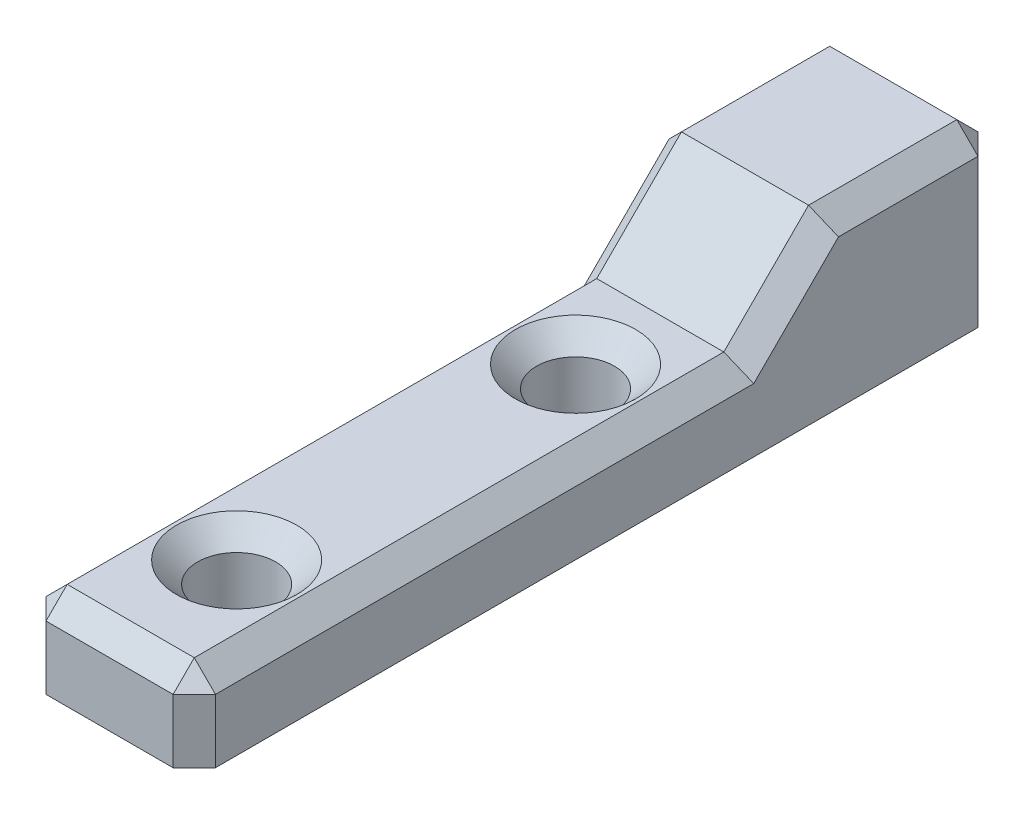
ISO-10303-21;
HEADER;
FILE_DESCRIPTION(('STEP AP214'),'2;1');
FILE_NAME('part.step','',(''),(''),'','','');
FILE_SCHEMA(('AUTOMOTIVE_DESIGN { 1 0 10303 214 1 1 1 1 }'));
ENDSEC;
DATA;
#1=APPLICATION_CONTEXT('core data for automotive mechanical design processes');
#2=APPLICATION_PROTOCOL_DEFINITION('international standard','automotive_design',2000,#1);
#3=PRODUCT_CONTEXT('',#1,'mechanical');
#4=PRODUCT('Part','Part','',(#3));
#5=PRODUCT_RELATED_PRODUCT_CATEGORY('part','',(#4));
#6=PRODUCT_DEFINITION_FORMATION('','',#4);
#7=PRODUCT_DEFINITION_CONTEXT('part definition',#1,'design');
#8=PRODUCT_DEFINITION('design','',#6,#7);
#9=PRODUCT_DEFINITION_SHAPE('','',#8);
#10=(LENGTH_UNIT() NAMED_UNIT(*) SI_UNIT(.MILLI.,.METRE.));
#11=(NAMED_UNIT(*) PLANE_ANGLE_UNIT() SI_UNIT($,.RADIAN.));
#12=(NAMED_UNIT(*) SI_UNIT($,.STERADIAN.) SOLID_ANGLE_UNIT());
#13=UNCERTAINTY_MEASURE_WITH_UNIT(LENGTH_MEASURE(1.E-05),#10,'distance_accuracy_value','');
#14=(GEOMETRIC_REPRESENTATION_CONTEXT(3) GLOBAL_UNCERTAINTY_ASSIGNED_CONTEXT((#13)) GLOBAL_UNIT_ASSIGNED_CONTEXT((#10,
#11,#12)) REPRESENTATION_CONTEXT('',''));
#15=CARTESIAN_POINT('',(0.,0.,0.));
#16=DIRECTION('',(0.,0.,1.));
#17=DIRECTION('',(1.,0.,0.));
#18=AXIS2_PLACEMENT_3D('',#15,#16,#17);
#19=CARTESIAN_POINT('',(0.,12.7,0.));
#20=DIRECTION('',(0.,-1.,0.));
#21=DIRECTION('',(0.,0.,-1.));
#22=AXIS2_PLACEMENT_3D('',#19,#20,#21);
#23=PLANE('',#22);
#24=DIRECTION('',(-1.,0.,0.));
#25=VECTOR('',#24,1.);
#26=CARTESIAN_POINT('',(0.,12.7,-58.7375));
#27=LINE('',#26,#25);
#28=CARTESIAN_POINT('',(11.1125,12.7,-58.7375));
#29=VERTEX_POINT('',#28);
#30=CARTESIAN_POINT('',(1.58749999999999,12.7,-58.7375));
#31=VERTEX_POINT('',#30);
#32=EDGE_CURVE('E251',#29,#31,#27,.T.);
#33=ORIENTED_EDGE('',*,*,#32,.T.);
#34=DIRECTION('',(0.,0.,1.));
#35=VECTOR('',#34,1.);
#36=CARTESIAN_POINT('',(1.58749999999999,12.7,0.));
#37=LINE('',#36,#35);
#38=CARTESIAN_POINT('',(1.58749999999999,12.7,-47.625));
#39=VERTEX_POINT('',#38);
#40=EDGE_CURVE('E254',#31,#39,#37,.T.);
#41=ORIENTED_EDGE('',*,*,#40,.T.);
#42=DIRECTION('',(1.,0.,0.));
#43=VECTOR('',#42,1.);
#44=CARTESIAN_POINT('',(0.,12.7,-47.625));
#45=LINE('',#44,#43);
#46=CARTESIAN_POINT('',(11.1125,12.7,-47.625));
#47=VERTEX_POINT('',#46);
#48=EDGE_CURVE('E338',#39,#47,#45,.T.);
#49=ORIENTED_EDGE('',*,*,#48,.T.);
#50=DIRECTION('',(0.,0.,-1.));
#51=VECTOR('',#50,1.);
#52=CARTESIAN_POINT('',(11.1125,12.7,0.));
#53=LINE('',#52,#51);
#54=EDGE_CURVE('E248',#47,#29,#53,.T.);
#55=ORIENTED_EDGE('',*,*,#54,.T.);
#56=EDGE_LOOP('',(#33,#41,#49,#55));
#57=FACE_BOUND('',#56,.T.);
#58=ADVANCED_FACE('F41',(#57),#23,.F.);
#59=CARTESIAN_POINT('',(0.,0.,0.));
#60=DIRECTION('',(0.,-1.,0.));
#61=DIRECTION('',(0.,0.,-1.));
#62=AXIS2_PLACEMENT_3D('',#59,#60,#61);
#63=PLANE('',#62);
#64=CARTESIAN_POINT('',(6.35,0.,-9.525));
#65=DIRECTION('',(0.,1.,0.));
#66=DIRECTION('',(0.,0.,1.));
#67=AXIS2_PLACEMENT_3D('',#64,#65,#66);
#68=CIRCLE('',#67,2.921);
#69=CARTESIAN_POINT('',(6.35,0.,-6.604));
#70=VERTEX_POINT('',#69);
#71=EDGE_CURVE('E183',#70,#70,#68,.T.);
#72=ORIENTED_EDGE('',*,*,#71,.T.);
#73=EDGE_LOOP('',(#72));
#74=FACE_BOUND('',#73,.T.);
#75=DIRECTION('',(1.,0.,0.));
#76=VECTOR('',#75,1.);
#77=CARTESIAN_POINT('',(0.,0.,0.));
#78=LINE('',#77,#76);
#79=CARTESIAN_POINT('',(1.58749999999999,0.,0.));
#80=VERTEX_POINT('',#79);
#81=CARTESIAN_POINT('',(11.1125,0.,0.));
#82=VERTEX_POINT('',#81);
#83=EDGE_CURVE('E161',#80,#82,#78,.T.);
#84=ORIENTED_EDGE('',*,*,#83,.F.);
#85=DIRECTION('',(0.707106781186546,0.,0.707106781186549));
#86=VECTOR('',#85,1.);
#87=CARTESIAN_POINT('',(0.79375,0.,-0.793749999999996));
#88=LINE('',#87,#86);
#89=CARTESIAN_POINT('',(0.,0.,-1.5875));
#90=VERTEX_POINT('',#89);
#91=EDGE_CURVE('E144',#80,#90,#88,.F.);
#92=ORIENTED_EDGE('',*,*,#91,.T.);
#93=DIRECTION('',(0.,0.,1.));
#94=VECTOR('',#93,1.);
#95=CARTESIAN_POINT('',(0.,0.,0.));
#96=LINE('',#95,#94);
#97=CARTESIAN_POINT('',(0.,0.,-58.7375));
#98=VERTEX_POINT('',#97);
#99=EDGE_CURVE('E176',#98,#90,#96,.T.);
#100=ORIENTED_EDGE('',*,*,#99,.F.);
#101=DIRECTION('',(-0.707106781186549,0.,0.707106781186546));
#102=VECTOR('',#101,1.);
#103=CARTESIAN_POINT('',(-29.36875,0.,-29.3687500000001));
#104=LINE('',#103,#102);
#105=CARTESIAN_POINT('',(1.5875,0.,-60.325));
#106=VERTEX_POINT('',#105);
#107=EDGE_CURVE('E199',#98,#106,#104,.F.);
#108=ORIENTED_EDGE('',*,*,#107,.T.);
#109=DIRECTION('',(-1.,0.,0.));
#110=VECTOR('',#109,1.);
#111=CARTESIAN_POINT('',(0.,0.,-60.325));
#112=LINE('',#111,#110);
#113=CARTESIAN_POINT('',(11.1125,0.,-60.325));
#114=VERTEX_POINT('',#113);
#115=EDGE_CURVE('E181',#114,#106,#112,.T.);
#116=ORIENTED_EDGE('',*,*,#115,.F.);
#117=DIRECTION('',(-0.707106781186546,0.,-0.707106781186549));
#118=VECTOR('',#117,1.);
#119=CARTESIAN_POINT('',(35.71875,0.,-35.7187499999999));
#120=LINE('',#119,#118);
#121=CARTESIAN_POINT('',(12.7,0.,-58.7375));
#122=VERTEX_POINT('',#121);
#123=EDGE_CURVE('E167',#114,#122,#120,.F.);
#124=ORIENTED_EDGE('',*,*,#123,.T.);
#125=DIRECTION('',(0.,0.,-1.));
#126=VECTOR('',#125,1.);
#127=CARTESIAN_POINT('',(12.7,0.,0.));
#128=LINE('',#127,#126);
#129=CARTESIAN_POINT('',(12.7,0.,-1.5875));
#130=VERTEX_POINT('',#129);
#131=EDGE_CURVE('E175',#130,#122,#128,.T.);
#132=ORIENTED_EDGE('',*,*,#131,.F.);
#133=DIRECTION('',(0.707106781186546,0.,-0.707106781186549));
#134=VECTOR('',#133,1.);
#135=CARTESIAN_POINT('',(5.55625000000003,0.,5.55625));
#136=LINE('',#135,#134);
#137=EDGE_CURVE('E156',#130,#82,#136,.F.);
#138=ORIENTED_EDGE('',*,*,#137,.T.);
#139=EDGE_LOOP('',(#84,#92,#100,#108,#116,#124,#132,#138));
#140=FACE_BOUND('',#139,.T.);
#141=CARTESIAN_POINT('',(6.35,0.,-34.925));
#142=DIRECTION('',(0.,1.,0.));
#143=DIRECTION('',(0.,0.,1.));
#144=AXIS2_PLACEMENT_3D('',#141,#142,#143);
#145=CIRCLE('',#144,2.921);
#146=CARTESIAN_POINT('',(6.35,0.,-32.004));
#147=VERTEX_POINT('',#146);
#148=EDGE_CURVE('E344',#147,#147,#145,.T.);
#149=ORIENTED_EDGE('',*,*,#148,.T.);
#150=EDGE_LOOP('',(#149));
#151=FACE_BOUND('',#150,.T.);
#152=ADVANCED_FACE('F170',(#74,#140,#151),#63,.T.);
#153=CARTESIAN_POINT('',(0.,12.7,0.));
#154=DIRECTION('',(1.,0.,0.));
#155=DIRECTION('',(0.,0.,-1.));
#156=AXIS2_PLACEMENT_3D('',#153,#154,#155);
#157=PLANE('',#156);
#158=DIRECTION('',(0.,0.,-1.));
#159=VECTOR('',#158,1.);
#160=CARTESIAN_POINT('',(0.,11.1125,0.));
#161=LINE('',#160,#159);
#162=CARTESIAN_POINT('',(0.,11.1125,-48.2825640302673));
#163=VERTEX_POINT('',#162);
#164=CARTESIAN_POINT('',(0.,11.1125,-58.7375));
#165=VERTEX_POINT('',#164);
#166=EDGE_CURVE('E211',#163,#165,#161,.T.);
#167=ORIENTED_EDGE('',*,*,#166,.T.);
#168=DIRECTION('',(0.,-1.,0.));
#169=VECTOR('',#168,1.);
#170=CARTESIAN_POINT('',(0.,12.7,-58.7375));
#171=LINE('',#170,#169);
#172=EDGE_CURVE('E214',#165,#98,#171,.T.);
#173=ORIENTED_EDGE('',*,*,#172,.T.);
#174=ORIENTED_EDGE('',*,*,#99,.T.);
#175=DIRECTION('',(0.,1.,0.));
#176=VECTOR('',#175,1.);
#177=CARTESIAN_POINT('',(0.,12.7,-1.5875));
#178=LINE('',#177,#176);
#179=CARTESIAN_POINT('',(0.,4.7625,-1.5875));
#180=VERTEX_POINT('',#179);
#181=EDGE_CURVE('E149',#90,#180,#178,.T.);
#182=ORIENTED_EDGE('',*,*,#181,.T.);
#183=DIRECTION('',(0.,0.,-1.));
#184=VECTOR('',#183,1.);
#185=CARTESIAN_POINT('',(0.,4.7625,0.));
#186=LINE('',#185,#184);
#187=CARTESIAN_POINT('',(0.,4.7625,-41.9325640302673));
#188=VERTEX_POINT('',#187);
#189=EDGE_CURVE('E155',#180,#188,#186,.T.);
#190=ORIENTED_EDGE('',*,*,#189,.T.);
#191=DIRECTION('',(0.,0.707106781186549,-0.707106781186546));
#192=VECTOR('',#191,1.);
#193=CARTESIAN_POINT('',(0.,-12.2350320151336,-24.9350320151337));
#194=LINE('',#193,#192);
#195=EDGE_CURVE('E206',#188,#163,#194,.T.);
#196=ORIENTED_EDGE('',*,*,#195,.T.);
#197=EDGE_LOOP('',(#167,#173,#174,#182,#190,#196));
#198=FACE_BOUND('',#197,.T.);
#199=ADVANCED_FACE('F378',(#198),#157,.F.);
#200=CARTESIAN_POINT('',(0.,12.7,0.));
#201=DIRECTION('',(0.,0.,-1.));
#202=DIRECTION('',(-1.,0.,0.));
#203=AXIS2_PLACEMENT_3D('',#200,#201,#202);
#204=PLANE('',#203);
#205=DIRECTION('',(-1.,0.,0.));
#206=VECTOR('',#205,1.);
#207=CARTESIAN_POINT('',(0.,4.7625,0.));
#208=LINE('',#207,#206);
#209=CARTESIAN_POINT('',(11.1125,4.7625,0.));
#210=VERTEX_POINT('',#209);
#211=CARTESIAN_POINT('',(1.58749999999999,4.7625,0.));
#212=VERTEX_POINT('',#211);
#213=EDGE_CURVE('E164',#210,#212,#208,.T.);
#214=ORIENTED_EDGE('',*,*,#213,.T.);
#215=DIRECTION('',(0.,-1.,0.));
#216=VECTOR('',#215,1.);
#217=CARTESIAN_POINT('',(1.58749999999999,12.7,0.));
#218=LINE('',#217,#216);
#219=EDGE_CURVE('E148',#212,#80,#218,.T.);
#220=ORIENTED_EDGE('',*,*,#219,.T.);
#221=ORIENTED_EDGE('',*,*,#83,.T.);
#222=DIRECTION('',(0.,1.,0.));
#223=VECTOR('',#222,1.);
#224=CARTESIAN_POINT('',(11.1125,12.7,0.));
#225=LINE('',#224,#223);
#226=EDGE_CURVE('E168',#82,#210,#225,.T.);
#227=ORIENTED_EDGE('',*,*,#226,.T.);
#228=EDGE_LOOP('',(#214,#220,#221,#227));
#229=FACE_BOUND('',#228,.T.);
#230=ADVANCED_FACE('F160',(#229),#204,.F.);
#231=CARTESIAN_POINT('',(12.7,12.7,0.));
#232=DIRECTION('',(-1.,0.,0.));
#233=DIRECTION('',(0.,0.,1.));
#234=AXIS2_PLACEMENT_3D('',#231,#232,#233);
#235=PLANE('',#234);
#236=DIRECTION('',(0.,0.,1.));
#237=VECTOR('',#236,1.);
#238=CARTESIAN_POINT('',(12.7,4.7625,0.));
#239=LINE('',#238,#237);
#240=CARTESIAN_POINT('',(12.7,4.7625,-41.9325640302673));
#241=VERTEX_POINT('',#240);
#242=CARTESIAN_POINT('',(12.7,4.7625,-1.5875));
#243=VERTEX_POINT('',#242);
#244=EDGE_CURVE('E217',#241,#243,#239,.T.);
#245=ORIENTED_EDGE('',*,*,#244,.T.);
#246=DIRECTION('',(0.,-1.,0.));
#247=VECTOR('',#246,1.);
#248=CARTESIAN_POINT('',(12.7,12.7,-1.5875));
#249=LINE('',#248,#247);
#250=EDGE_CURVE('E229',#243,#130,#249,.T.);
#251=ORIENTED_EDGE('',*,*,#250,.T.);
#252=ORIENTED_EDGE('',*,*,#131,.T.);
#253=DIRECTION('',(0.,1.,0.));
#254=VECTOR('',#253,1.);
#255=CARTESIAN_POINT('',(12.7,12.7,-58.7375));
#256=LINE('',#255,#254);
#257=CARTESIAN_POINT('',(12.7,11.1125,-58.7375));
#258=VERTEX_POINT('',#257);
#259=EDGE_CURVE('E226',#122,#258,#256,.T.);
#260=ORIENTED_EDGE('',*,*,#259,.T.);
#261=DIRECTION('',(0.,0.,1.));
#262=VECTOR('',#261,1.);
#263=CARTESIAN_POINT('',(12.7,11.1125,0.));
#264=LINE('',#263,#262);
#265=CARTESIAN_POINT('',(12.7,11.1125,-48.2825640302673));
#266=VERTEX_POINT('',#265);
#267=EDGE_CURVE('E223',#258,#266,#264,.T.);
#268=ORIENTED_EDGE('',*,*,#267,.T.);
#269=DIRECTION('',(0.,-0.707106781186549,0.707106781186546));
#270=VECTOR('',#269,1.);
#271=CARTESIAN_POINT('',(12.7,-12.2350320151337,-24.9350320151337));
#272=LINE('',#271,#270);
#273=EDGE_CURVE('E220',#266,#241,#272,.T.);
#274=ORIENTED_EDGE('',*,*,#273,.T.);
#275=EDGE_LOOP('',(#245,#251,#252,#260,#268,#274));
#276=FACE_BOUND('',#275,.T.);
#277=ADVANCED_FACE('F370',(#276),#235,.F.);
#278=CARTESIAN_POINT('',(0.,12.7,-60.325));
#279=DIRECTION('',(0.,0.,1.));
#280=DIRECTION('',(1.,0.,0.));
#281=AXIS2_PLACEMENT_3D('',#278,#279,#280);
#282=PLANE('',#281);
#283=ORIENTED_EDGE('',*,*,#115,.T.);
#284=DIRECTION('',(0.,1.,0.));
#285=VECTOR('',#284,1.);
#286=CARTESIAN_POINT('',(1.5875,12.7,-60.325));
#287=LINE('',#286,#285);
#288=CARTESIAN_POINT('',(1.5875,11.1125,-60.325));
#289=VERTEX_POINT('',#288);
#290=EDGE_CURVE('E238',#106,#289,#287,.T.);
#291=ORIENTED_EDGE('',*,*,#290,.T.);
#292=DIRECTION('',(1.,0.,0.));
#293=VECTOR('',#292,1.);
#294=CARTESIAN_POINT('',(0.,11.1125,-60.325));
#295=LINE('',#294,#293);
#296=CARTESIAN_POINT('',(11.1125,11.1125,-60.325));
#297=VERTEX_POINT('',#296);
#298=EDGE_CURVE('E232',#289,#297,#295,.T.);
#299=ORIENTED_EDGE('',*,*,#298,.T.);
#300=DIRECTION('',(0.,-1.,0.));
#301=VECTOR('',#300,1.);
#302=CARTESIAN_POINT('',(11.1125,12.7,-60.325));
#303=LINE('',#302,#301);
#304=EDGE_CURVE('E235',#297,#114,#303,.T.);
#305=ORIENTED_EDGE('',*,*,#304,.T.);
#306=EDGE_LOOP('',(#283,#291,#299,#305));
#307=FACE_BOUND('',#306,.T.);
#308=ADVANCED_FACE('F360',(#307),#282,.F.);
#309=CARTESIAN_POINT('',(6.35,12.7,-9.525));
#310=DIRECTION('',(0.,-1.,0.));
#311=DIRECTION('',(0.,0.,-1.));
#312=AXIS2_PLACEMENT_3D('',#309,#310,#311);
#313=CYLINDRICAL_SURFACE('',#312,2.921);
#314=CARTESIAN_POINT('',(6.35,4.76249999999999,-9.525));
#315=DIRECTION('',(0.,-1.,0.));
#316=DIRECTION('',(0.,0.,-1.));
#317=AXIS2_PLACEMENT_3D('',#314,#315,#316);
#318=CIRCLE('',#317,2.921);
#319=CARTESIAN_POINT('',(6.35,4.76249999999999,-12.446));
#320=VERTEX_POINT('',#319);
#321=EDGE_CURVE('E52',#320,#320,#318,.F.);
#322=ORIENTED_EDGE('',*,*,#321,.T.);
#323=EDGE_LOOP('',(#322));
#324=FACE_BOUND('',#323,.T.);
#325=ORIENTED_EDGE('',*,*,#71,.F.);
#326=EDGE_LOOP('',(#325));
#327=FACE_BOUND('',#326,.T.);
#328=ADVANCED_FACE('F357',(#324,#327),#313,.F.);
#329=CARTESIAN_POINT('',(6.35,12.7,-34.925));
#330=DIRECTION('',(0.,-1.,0.));
#331=DIRECTION('',(0.,0.,-1.));
#332=AXIS2_PLACEMENT_3D('',#329,#330,#331);
#333=CYLINDRICAL_SURFACE('',#332,2.921);
#334=CARTESIAN_POINT('',(6.35,4.76250000000001,-34.925));
#335=DIRECTION('',(0.,-1.,0.));
#336=DIRECTION('',(0.,0.,-1.));
#337=AXIS2_PLACEMENT_3D('',#334,#335,#336);
#338=CIRCLE('',#337,2.921);
#339=CARTESIAN_POINT('',(6.35,4.76250000000001,-37.846));
#340=VERTEX_POINT('',#339);
#341=EDGE_CURVE('E11',#340,#340,#338,.F.);
#342=ORIENTED_EDGE('',*,*,#341,.T.);
#343=EDGE_LOOP('',(#342));
#344=FACE_BOUND('',#343,.T.);
#345=ORIENTED_EDGE('',*,*,#148,.F.);
#346=EDGE_LOOP('',(#345));
#347=FACE_BOUND('',#346,.T.);
#348=ADVANCED_FACE('F359',(#344,#347),#333,.F.);
#349=CARTESIAN_POINT('',(0.,6.35,0.));
#350=DIRECTION('',(0.,-1.,0.));
#351=DIRECTION('',(0.,0.,-1.));
#352=AXIS2_PLACEMENT_3D('',#349,#350,#351);
#353=PLANE('',#352);
#354=CARTESIAN_POINT('',(6.35,6.35,-9.525));
#355=DIRECTION('',(0.,-1.,0.));
#356=DIRECTION('',(0.,0.,-1.));
#357=AXIS2_PLACEMENT_3D('',#354,#355,#356);
#358=CIRCLE('',#357,4.50850000000001);
#359=CARTESIAN_POINT('',(6.35,6.35,-14.0335));
#360=VERTEX_POINT('',#359);
#361=EDGE_CURVE('E261',#360,#360,#358,.T.);
#362=ORIENTED_EDGE('',*,*,#361,.T.);
#363=EDGE_LOOP('',(#362));
#364=FACE_BOUND('',#363,.T.);
#365=CARTESIAN_POINT('',(6.35,6.35,-34.925));
#366=DIRECTION('',(0.,-1.,0.));
#367=DIRECTION('',(0.,0.,-1.));
#368=AXIS2_PLACEMENT_3D('',#365,#366,#367);
#369=CIRCLE('',#368,4.50849999999999);
#370=CARTESIAN_POINT('',(6.35,6.35,-39.4335));
#371=VERTEX_POINT('',#370);
#372=EDGE_CURVE('E257',#371,#371,#369,.T.);
#373=ORIENTED_EDGE('',*,*,#372,.T.);
#374=EDGE_LOOP('',(#373));
#375=FACE_BOUND('',#374,.T.);
#376=DIRECTION('',(-1.,0.,0.));
#377=VECTOR('',#376,1.);
#378=CARTESIAN_POINT('',(0.,6.35,-41.275));
#379=LINE('',#378,#377);
#380=CARTESIAN_POINT('',(11.1125,6.35,-41.275));
#381=VERTEX_POINT('',#380);
#382=CARTESIAN_POINT('',(1.58749999999999,6.35,-41.275));
#383=VERTEX_POINT('',#382);
#384=EDGE_CURVE('E190',#381,#383,#379,.T.);
#385=ORIENTED_EDGE('',*,*,#384,.T.);
#386=DIRECTION('',(0.,0.,1.));
#387=VECTOR('',#386,1.);
#388=CARTESIAN_POINT('',(1.58749999999999,6.35,0.));
#389=LINE('',#388,#387);
#390=CARTESIAN_POINT('',(1.58749999999999,6.35,-1.58749999999999));
#391=VERTEX_POINT('',#390);
#392=EDGE_CURVE('E60',#383,#391,#389,.T.);
#393=ORIENTED_EDGE('',*,*,#392,.T.);
#394=DIRECTION('',(1.,0.,0.));
#395=VECTOR('',#394,1.);
#396=CARTESIAN_POINT('',(0.,6.35,-1.58749999999999));
#397=LINE('',#396,#395);
#398=CARTESIAN_POINT('',(11.1125,6.35,-1.58749999999999));
#399=VERTEX_POINT('',#398);
#400=EDGE_CURVE('E64',#391,#399,#397,.T.);
#401=ORIENTED_EDGE('',*,*,#400,.T.);
#402=DIRECTION('',(0.,0.,-1.));
#403=VECTOR('',#402,1.);
#404=CARTESIAN_POINT('',(11.1125,6.35,0.));
#405=LINE('',#404,#403);
#406=EDGE_CURVE('E265',#399,#381,#405,.T.);
#407=ORIENTED_EDGE('',*,*,#406,.T.);
#408=EDGE_LOOP('',(#385,#393,#401,#407));
#409=FACE_BOUND('',#408,.T.);
#410=ADVANCED_FACE('F367',(#364,#375,#409),#353,.F.);
#411=CARTESIAN_POINT('',(0.,12.7,-47.625));
#412=DIRECTION('',(0.,0.707106781186546,0.707106781186549));
#413=DIRECTION('',(-1.,0.,0.));
#414=AXIS2_PLACEMENT_3D('',#411,#412,#413);
#415=PLANE('',#414);
#416=ORIENTED_EDGE('',*,*,#48,.F.);
#417=DIRECTION('',(0.,0.707106781186549,-0.707106781186546));
#418=VECTOR('',#417,1.);
#419=CARTESIAN_POINT('',(1.5875,12.7,-47.625));
#420=LINE('',#419,#418);
#421=EDGE_CURVE('E244',#39,#383,#420,.F.);
#422=ORIENTED_EDGE('',*,*,#421,.T.);
#423=ORIENTED_EDGE('',*,*,#384,.F.);
#424=DIRECTION('',(0.,-0.707106781186549,0.707106781186546));
#425=VECTOR('',#424,1.);
#426=CARTESIAN_POINT('',(11.1125,12.7,-47.625));
#427=LINE('',#426,#425);
#428=EDGE_CURVE('E241',#381,#47,#427,.F.);
#429=ORIENTED_EDGE('',*,*,#428,.T.);
#430=EDGE_LOOP('',(#416,#422,#423,#429));
#431=FACE_BOUND('',#430,.T.);
#432=ADVANCED_FACE('F390',(#431),#415,.T.);
#433=CARTESIAN_POINT('',(11.1125,12.7,-60.325));
#434=DIRECTION('',(-0.707106781186549,0.,0.707106781186546));
#435=DIRECTION('',(0.,-1.,0.));
#436=AXIS2_PLACEMENT_3D('',#433,#434,#435);
#437=PLANE('',#436);
#438=DIRECTION('',(0.707106781186546,0.,0.707106781186549));
#439=VECTOR('',#438,1.);
#440=CARTESIAN_POINT('',(12.7,11.1125,-58.7375));
#441=LINE('',#440,#439);
#442=EDGE_CURVE('E46',#258,#297,#441,.F.);
#443=ORIENTED_EDGE('',*,*,#442,.F.);
#444=ORIENTED_EDGE('',*,*,#259,.F.);
#445=ORIENTED_EDGE('',*,*,#123,.F.);
#446=ORIENTED_EDGE('',*,*,#304,.F.);
#447=EDGE_LOOP('',(#443,#444,#445,#446));
#448=FACE_BOUND('',#447,.T.);
#449=ADVANCED_FACE('F396',(#448),#437,.F.);
#450=CARTESIAN_POINT('',(12.7,11.1125,-58.7375));
#451=DIRECTION('',(0.577350269189628,0.577350269189623,-0.577350269189626));
#452=DIRECTION('',(-0.707106781186546,0.,-0.707106781186549));
#453=AXIS2_PLACEMENT_3D('',#450,#451,#452);
#454=PLANE('',#453);
#455=DIRECTION('',(-0.707106781186546,0.707106781186549,0.));
#456=VECTOR('',#455,1.);
#457=CARTESIAN_POINT('',(12.7,11.1125,-58.7375));
#458=LINE('',#457,#456);
#459=EDGE_CURVE('E326',#258,#29,#458,.T.);
#460=ORIENTED_EDGE('',*,*,#459,.F.);
#461=ORIENTED_EDGE('',*,*,#442,.T.);
#462=DIRECTION('',(0.,-0.707106781186549,-0.707106781186546));
#463=VECTOR('',#462,1.);
#464=CARTESIAN_POINT('',(11.1125,11.90625,-59.53125));
#465=LINE('',#464,#463);
#466=EDGE_CURVE('E329',#29,#297,#465,.T.);
#467=ORIENTED_EDGE('',*,*,#466,.F.);
#468=EDGE_LOOP('',(#460,#461,#467));
#469=FACE_BOUND('',#468,.T.);
#470=ADVANCED_FACE('F495',(#469),#454,.T.);
#471=CARTESIAN_POINT('',(0.,12.7,-58.7375));
#472=DIRECTION('',(0.707106781186546,0.,0.707106781186549));
#473=DIRECTION('',(0.,-1.,0.));
#474=AXIS2_PLACEMENT_3D('',#471,#472,#473);
#475=PLANE('',#474);
#476=ORIENTED_EDGE('',*,*,#107,.F.);
#477=ORIENTED_EDGE('',*,*,#172,.F.);
#478=DIRECTION('',(0.707106781186549,0.,-0.707106781186546));
#479=VECTOR('',#478,1.);
#480=CARTESIAN_POINT('',(1.5875,11.1125,-60.325));
#481=LINE('',#480,#479);
#482=EDGE_CURVE('E322',#289,#165,#481,.F.);
#483=ORIENTED_EDGE('',*,*,#482,.F.);
#484=ORIENTED_EDGE('',*,*,#290,.F.);
#485=EDGE_LOOP('',(#476,#477,#483,#484));
#486=FACE_BOUND('',#485,.T.);
#487=ADVANCED_FACE('F489',(#486),#475,.F.);
#488=CARTESIAN_POINT('',(0.,12.7,-58.7375));
#489=DIRECTION('',(0.,-0.707106781186546,0.707106781186549));
#490=DIRECTION('',(-1.,0.,0.));
#491=AXIS2_PLACEMENT_3D('',#488,#489,#490);
#492=PLANE('',#491);
#493=ORIENTED_EDGE('',*,*,#466,.T.);
#494=ORIENTED_EDGE('',*,*,#298,.F.);
#495=DIRECTION('',(0.,0.707106781186549,0.707106781186546));
#496=VECTOR('',#495,1.);
#497=CARTESIAN_POINT('',(1.5875,11.1125,-60.325));
#498=LINE('',#497,#496);
#499=EDGE_CURVE('E318',#31,#289,#498,.F.);
#500=ORIENTED_EDGE('',*,*,#499,.F.);
#501=ORIENTED_EDGE('',*,*,#32,.F.);
#502=EDGE_LOOP('',(#493,#494,#500,#501));
#503=FACE_BOUND('',#502,.T.);
#504=ADVANCED_FACE('F482',(#503),#492,.F.);
#505=CARTESIAN_POINT('',(11.1125,12.7,0.));
#506=DIRECTION('',(-0.707106781186549,-0.707106781186546,0.));
#507=DIRECTION('',(0.,0.,-1.));
#508=AXIS2_PLACEMENT_3D('',#505,#506,#507);
#509=PLANE('',#508);
#510=ORIENTED_EDGE('',*,*,#459,.T.);
#511=ORIENTED_EDGE('',*,*,#54,.F.);
#512=DIRECTION('',(0.678598344545844,-0.678598344545847,-0.281084637714825));
#513=VECTOR('',#512,1.);
#514=CARTESIAN_POINT('',(18.9980468039446,4.81445319605536,-50.8913004329217));
#515=LINE('',#514,#513);
#516=EDGE_CURVE('E314',#266,#47,#515,.F.);
#517=ORIENTED_EDGE('',*,*,#516,.F.);
#518=ORIENTED_EDGE('',*,*,#267,.F.);
#519=EDGE_LOOP('',(#510,#511,#517,#518));
#520=FACE_BOUND('',#519,.T.);
#521=ADVANCED_FACE('F475',(#520),#509,.F.);
#522=CARTESIAN_POINT('',(1.5875,11.1125,-60.325));
#523=DIRECTION('',(-0.577350269189626,0.577350269189623,-0.577350269189628));
#524=DIRECTION('',(-0.707106781186549,0.,0.707106781186546));
#525=AXIS2_PLACEMENT_3D('',#522,#523,#524);
#526=PLANE('',#525);
#527=ORIENTED_EDGE('',*,*,#499,.T.);
#528=ORIENTED_EDGE('',*,*,#482,.T.);
#529=DIRECTION('',(-0.707106781186546,-0.707106781186549,0.));
#530=VECTOR('',#529,1.);
#531=CARTESIAN_POINT('',(0.793749999999996,11.90625,-58.7375));
#532=LINE('',#531,#530);
#533=EDGE_CURVE('E310',#31,#165,#532,.T.);
#534=ORIENTED_EDGE('',*,*,#533,.F.);
#535=EDGE_LOOP('',(#527,#528,#534));
#536=FACE_BOUND('',#535,.T.);
#537=ADVANCED_FACE('F468',(#536),#526,.T.);
#538=CARTESIAN_POINT('',(12.7,-12.2350320151336,-24.9350320151337));
#539=DIRECTION('',(0.707106781186551,0.499999999999997,0.499999999999999));
#540=DIRECTION('',(0.,0.707106781186549,-0.707106781186546));
#541=AXIS2_PLACEMENT_3D('',#538,#539,#540);
#542=PLANE('',#541);
#543=ORIENTED_EDGE('',*,*,#516,.T.);
#544=ORIENTED_EDGE('',*,*,#428,.F.);
#545=DIRECTION('',(0.678598344545844,-0.678598344545847,-0.281084637714825));
#546=VECTOR('',#545,1.);
#547=CARTESIAN_POINT('',(17.2851206934193,0.177379306580685,-43.8317832065992));
#548=LINE('',#547,#546);
#549=EDGE_CURVE('E306',#241,#381,#548,.F.);
#550=ORIENTED_EDGE('',*,*,#549,.F.);
#551=ORIENTED_EDGE('',*,*,#273,.F.);
#552=EDGE_LOOP('',(#543,#544,#550,#551));
#553=FACE_BOUND('',#552,.T.);
#554=ADVANCED_FACE('F461',(#553),#542,.T.);
#555=CARTESIAN_POINT('',(1.58749999999999,12.7,0.));
#556=DIRECTION('',(0.707106781186549,-0.707106781186546,0.));
#557=DIRECTION('',(0.,0.,1.));
#558=AXIS2_PLACEMENT_3D('',#555,#556,#557);
#559=PLANE('',#558);
#560=ORIENTED_EDGE('',*,*,#533,.T.);
#561=ORIENTED_EDGE('',*,*,#166,.F.);
#562=DIRECTION('',(-0.678598344545846,-0.678598344545849,-0.281084637714816));
#563=VECTOR('',#562,1.);
#564=CARTESIAN_POINT('',(10.6716625131796,21.7841625131796,-43.8622166842398));
#565=LINE('',#564,#563);
#566=EDGE_CURVE('E302',#39,#163,#565,.T.);
#567=ORIENTED_EDGE('',*,*,#566,.F.);
#568=ORIENTED_EDGE('',*,*,#40,.F.);
#569=EDGE_LOOP('',(#560,#561,#567,#568));
#570=FACE_BOUND('',#569,.T.);
#571=ADVANCED_FACE('F454',(#570),#559,.F.);
#572=CARTESIAN_POINT('',(11.1125,6.35,0.));
#573=DIRECTION('',(-0.707106781186549,-0.707106781186546,0.));
#574=DIRECTION('',(0.,0.,-1.));
#575=AXIS2_PLACEMENT_3D('',#572,#573,#574);
#576=PLANE('',#575);
#577=ORIENTED_EDGE('',*,*,#549,.T.);
#578=ORIENTED_EDGE('',*,*,#406,.F.);
#579=DIRECTION('',(0.707106781186546,-0.707106781186549,0.));
#580=VECTOR('',#579,1.);
#581=CARTESIAN_POINT('',(11.90625,5.55625,-1.5875));
#582=LINE('',#581,#580);
#583=EDGE_CURVE('E298',#243,#399,#582,.F.);
#584=ORIENTED_EDGE('',*,*,#583,.F.);
#585=ORIENTED_EDGE('',*,*,#244,.F.);
#586=EDGE_LOOP('',(#577,#578,#584,#585));
#587=FACE_BOUND('',#586,.T.);
#588=ADVANCED_FACE('F447',(#587),#576,.F.);
#589=CARTESIAN_POINT('',(12.7,12.7,-1.5875));
#590=DIRECTION('',(-0.707106781186549,0.,-0.707106781186546));
#591=DIRECTION('',(0.,-1.,0.));
#592=AXIS2_PLACEMENT_3D('',#589,#590,#591);
#593=PLANE('',#592);
#594=ORIENTED_EDGE('',*,*,#137,.F.);
#595=ORIENTED_EDGE('',*,*,#250,.F.);
#596=DIRECTION('',(-0.707106781186546,0.,0.707106781186549));
#597=VECTOR('',#596,1.);
#598=CARTESIAN_POINT('',(11.1125,4.7625,0.));
#599=LINE('',#598,#597);
#600=EDGE_CURVE('E294',#210,#243,#599,.F.);
#601=ORIENTED_EDGE('',*,*,#600,.F.);
#602=ORIENTED_EDGE('',*,*,#226,.F.);
#603=EDGE_LOOP('',(#594,#595,#601,#602));
#604=FACE_BOUND('',#603,.T.);
#605=ADVANCED_FACE('F440',(#604),#593,.F.);
#606=CARTESIAN_POINT('',(0.,-12.2350320151336,-24.9350320151337));
#607=DIRECTION('',(-0.707106781186547,0.5,0.500000000000002));
#608=DIRECTION('',(0.,-0.707106781186549,0.707106781186546));
#609=AXIS2_PLACEMENT_3D('',#606,#607,#608);
#610=PLANE('',#609);
#611=ORIENTED_EDGE('',*,*,#566,.T.);
#612=ORIENTED_EDGE('',*,*,#195,.F.);
#613=DIRECTION('',(0.678598344545846,0.678598344545849,0.281084637714816));
#614=VECTOR('',#613,1.);
#615=CARTESIAN_POINT('',(-4.58512069341944,0.177379306580539,-43.8317832065991));
#616=LINE('',#615,#614);
#617=EDGE_CURVE('E290',#383,#188,#616,.F.);
#618=ORIENTED_EDGE('',*,*,#617,.F.);
#619=ORIENTED_EDGE('',*,*,#421,.F.);
#620=EDGE_LOOP('',(#611,#612,#618,#619));
#621=FACE_BOUND('',#620,.T.);
#622=ADVANCED_FACE('F433',(#621),#610,.T.);
#623=CARTESIAN_POINT('',(11.1125,4.7625,0.));
#624=DIRECTION('',(0.577350269189628,0.577350269189623,0.577350269189626));
#625=DIRECTION('',(0.707106781186546,0.,-0.707106781186549));
#626=AXIS2_PLACEMENT_3D('',#623,#624,#625);
#627=PLANE('',#626);
#628=ORIENTED_EDGE('',*,*,#600,.T.);
#629=ORIENTED_EDGE('',*,*,#583,.T.);
#630=DIRECTION('',(0.,0.707106781186549,-0.707106781186546));
#631=VECTOR('',#630,1.);
#632=CARTESIAN_POINT('',(11.1125,4.7625,0.));
#633=LINE('',#632,#631);
#634=EDGE_CURVE('E286',#210,#399,#633,.T.);
#635=ORIENTED_EDGE('',*,*,#634,.F.);
#636=EDGE_LOOP('',(#628,#629,#635));
#637=FACE_BOUND('',#636,.T.);
#638=ADVANCED_FACE('F426',(#637),#627,.T.);
#639=CARTESIAN_POINT('',(0.,4.7625,0.));
#640=DIRECTION('',(0.707106781186549,-0.707106781186546,0.));
#641=DIRECTION('',(0.,0.,-1.));
#642=AXIS2_PLACEMENT_3D('',#639,#640,#641);
#643=PLANE('',#642);
#644=ORIENTED_EDGE('',*,*,#617,.T.);
#645=ORIENTED_EDGE('',*,*,#189,.F.);
#646=DIRECTION('',(0.707106781186546,0.707106781186549,0.));
#647=VECTOR('',#646,1.);
#648=CARTESIAN_POINT('',(0.,4.7625,-1.5875));
#649=LINE('',#648,#647);
#650=EDGE_CURVE('E282',#391,#180,#649,.F.);
#651=ORIENTED_EDGE('',*,*,#650,.F.);
#652=ORIENTED_EDGE('',*,*,#392,.F.);
#653=EDGE_LOOP('',(#644,#645,#651,#652));
#654=FACE_BOUND('',#653,.T.);
#655=ADVANCED_FACE('F419',(#654),#643,.F.);
#656=CARTESIAN_POINT('',(0.,6.35,-1.58749999999999));
#657=DIRECTION('',(0.,-0.707106781186546,-0.707106781186549));
#658=DIRECTION('',(1.,0.,0.));
#659=AXIS2_PLACEMENT_3D('',#656,#657,#658);
#660=PLANE('',#659);
#661=ORIENTED_EDGE('',*,*,#634,.T.);
#662=ORIENTED_EDGE('',*,*,#400,.F.);
#663=DIRECTION('',(0.,-0.707106781186549,0.707106781186546));
#664=VECTOR('',#663,1.);
#665=CARTESIAN_POINT('',(1.58749999999999,5.55625,-0.793749999999996));
#666=LINE('',#665,#664);
#667=EDGE_CURVE('E278',#212,#391,#666,.F.);
#668=ORIENTED_EDGE('',*,*,#667,.F.);
#669=ORIENTED_EDGE('',*,*,#213,.F.);
#670=EDGE_LOOP('',(#661,#662,#668,#669));
#671=FACE_BOUND('',#670,.T.);
#672=ADVANCED_FACE('F412',(#671),#660,.F.);
#673=CARTESIAN_POINT('',(0.,4.7625,-1.5875));
#674=DIRECTION('',(-0.577350269189628,0.577350269189623,0.577350269189626));
#675=DIRECTION('',(0.707106781186546,0.,0.707106781186549));
#676=AXIS2_PLACEMENT_3D('',#673,#674,#675);
#677=PLANE('',#676);
#678=ORIENTED_EDGE('',*,*,#667,.T.);
#679=ORIENTED_EDGE('',*,*,#650,.T.);
#680=DIRECTION('',(-0.707106781186546,0.,-0.707106781186549));
#681=VECTOR('',#680,1.);
#682=CARTESIAN_POINT('',(0.,4.7625,-1.5875));
#683=LINE('',#682,#681);
#684=EDGE_CURVE('E275',#212,#180,#683,.T.);
#685=ORIENTED_EDGE('',*,*,#684,.F.);
#686=EDGE_LOOP('',(#678,#679,#685));
#687=FACE_BOUND('',#686,.T.);
#688=ADVANCED_FACE('F406',(#687),#677,.T.);
#689=CARTESIAN_POINT('',(1.58749999999999,12.7,0.));
#690=DIRECTION('',(0.707106781186549,0.,-0.707106781186546));
#691=DIRECTION('',(0.,-1.,0.));
#692=AXIS2_PLACEMENT_3D('',#689,#690,#691);
#693=PLANE('',#692);
#694=ORIENTED_EDGE('',*,*,#684,.T.);
#695=ORIENTED_EDGE('',*,*,#181,.F.);
#696=ORIENTED_EDGE('',*,*,#91,.F.);
#697=ORIENTED_EDGE('',*,*,#219,.F.);
#698=EDGE_LOOP('',(#694,#695,#696,#697));
#699=FACE_BOUND('',#698,.T.);
#700=ADVANCED_FACE('F147',(#699),#693,.F.);
#701=CARTESIAN_POINT('',(6.35,6.35,-9.525));
#702=DIRECTION('',(0.,1.,0.));
#703=DIRECTION('',(0.,0.,1.));
#704=AXIS2_PLACEMENT_3D('',#701,#702,#703);
#705=CONICAL_SURFACE('',#704,4.50850000000001,0.785398163397447);
#706=ORIENTED_EDGE('',*,*,#321,.F.);
#707=EDGE_LOOP('',(#706));
#708=FACE_BOUND('',#707,.T.);
#709=ORIENTED_EDGE('',*,*,#361,.F.);
#710=EDGE_LOOP('',(#709));
#711=FACE_BOUND('',#710,.T.);
#712=ADVANCED_FACE('F405',(#708,#711),#705,.F.);
#713=CARTESIAN_POINT('',(6.35,6.35,-34.925));
#714=DIRECTION('',(0.,1.,0.));
#715=DIRECTION('',(0.,0.,1.));
#716=AXIS2_PLACEMENT_3D('',#713,#714,#715);
#717=CONICAL_SURFACE('',#716,4.50849999999999,0.785398163397447);
#718=ORIENTED_EDGE('',*,*,#341,.F.);
#719=EDGE_LOOP('',(#718));
#720=FACE_BOUND('',#719,.T.);
#721=ORIENTED_EDGE('',*,*,#372,.F.);
#722=EDGE_LOOP('',(#721));
#723=FACE_BOUND('',#722,.T.);
#724=ADVANCED_FACE('F44',(#720,#723),#717,.F.);
#725=CLOSED_SHELL('',(#58,#152,#199,#230,#277,#308,#328,#348,#410,#432,#449,#470,#487,#504,#521,
#537,#554,#571,#588,#605,#622,#638,#655,#672,#688,#700,#712,#724));
#726=MANIFOLD_SOLID_BREP('B2',#725);
#727=ADVANCED_BREP_SHAPE_REPRESENTATION('',(#18,#726),#14);
#728=SHAPE_DEFINITION_REPRESENTATION(#9,#727);
ENDSEC;
END-ISO-10303-21;
